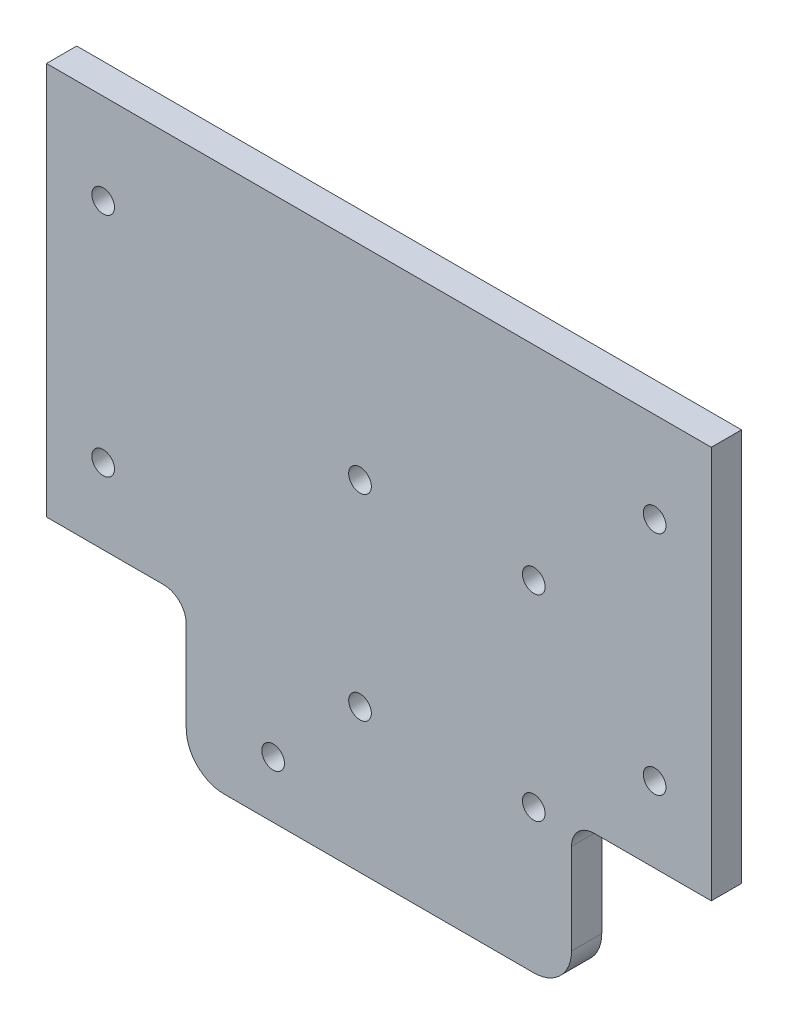
ISO-10303-21;
HEADER;
FILE_DESCRIPTION(('STEP AP214'),'2;1');
FILE_NAME('part.step','',(''),(''),'','','');
FILE_SCHEMA(('AUTOMOTIVE_DESIGN { 1 0 10303 214 1 1 1 1 }'));
ENDSEC;
DATA;
#1=APPLICATION_CONTEXT('core data for automotive mechanical design processes');
#2=APPLICATION_PROTOCOL_DEFINITION('international standard','automotive_design',2000,#1);
#3=PRODUCT_CONTEXT('',#1,'mechanical');
#4=PRODUCT('Part','Part','',(#3));
#5=PRODUCT_RELATED_PRODUCT_CATEGORY('part','',(#4));
#6=PRODUCT_DEFINITION_FORMATION('','',#4);
#7=PRODUCT_DEFINITION_CONTEXT('part definition',#1,'design');
#8=PRODUCT_DEFINITION('design','',#6,#7);
#9=PRODUCT_DEFINITION_SHAPE('','',#8);
#10=(LENGTH_UNIT() NAMED_UNIT(*) SI_UNIT(.MILLI.,.METRE.));
#11=(NAMED_UNIT(*) PLANE_ANGLE_UNIT() SI_UNIT($,.RADIAN.));
#12=(NAMED_UNIT(*) SI_UNIT($,.STERADIAN.) SOLID_ANGLE_UNIT());
#13=UNCERTAINTY_MEASURE_WITH_UNIT(LENGTH_MEASURE(1.E-05),#10,'distance_accuracy_value','');
#14=(GEOMETRIC_REPRESENTATION_CONTEXT(3) GLOBAL_UNCERTAINTY_ASSIGNED_CONTEXT((#13)) GLOBAL_UNIT_ASSIGNED_CONTEXT((#10,
#11,#12)) REPRESENTATION_CONTEXT('',''));
#15=CARTESIAN_POINT('',(0.,0.,0.));
#16=DIRECTION('',(0.,0.,1.));
#17=DIRECTION('',(1.,0.,0.));
#18=AXIS2_PLACEMENT_3D('',#15,#16,#17);
#19=CARTESIAN_POINT('',(0.,0.,4.));
#20=DIRECTION('',(1.,0.,0.));
#21=DIRECTION('',(0.,0.,-1.));
#22=AXIS2_PLACEMENT_3D('',#19,#20,#21);
#23=PLANE('',#22);
#24=DIRECTION('',(0.,-1.,0.));
#25=VECTOR('',#24,1.);
#26=CARTESIAN_POINT('',(0.,0.,0.));
#27=LINE('',#26,#25);
#28=CARTESIAN_POINT('',(0.,72.,0.));
#29=VERTEX_POINT('',#28);
#30=CARTESIAN_POINT('',(0.,20.,0.));
#31=VERTEX_POINT('',#30);
#32=EDGE_CURVE('E168',#29,#31,#27,.T.);
#33=ORIENTED_EDGE('',*,*,#32,.T.);
#34=DIRECTION('',(0.,0.,1.));
#35=VECTOR('',#34,1.);
#36=CARTESIAN_POINT('',(0.,20.,0.));
#37=LINE('',#36,#35);
#38=CARTESIAN_POINT('',(0.,20.,4.));
#39=VERTEX_POINT('',#38);
#40=EDGE_CURVE('E254',#31,#39,#37,.T.);
#41=ORIENTED_EDGE('',*,*,#40,.T.);
#42=DIRECTION('',(0.,-1.,0.));
#43=VECTOR('',#42,1.);
#44=CARTESIAN_POINT('',(0.,0.,4.));
#45=LINE('',#44,#43);
#46=CARTESIAN_POINT('',(0.,72.,4.));
#47=VERTEX_POINT('',#46);
#48=EDGE_CURVE('E165',#47,#39,#45,.T.);
#49=ORIENTED_EDGE('',*,*,#48,.F.);
#50=DIRECTION('',(0.,0.,-1.));
#51=VECTOR('',#50,1.);
#52=CARTESIAN_POINT('',(0.,72.,4.));
#53=LINE('',#52,#51);
#54=EDGE_CURVE('E172',#47,#29,#53,.T.);
#55=ORIENTED_EDGE('',*,*,#54,.T.);
#56=EDGE_LOOP('',(#33,#41,#49,#55));
#57=FACE_BOUND('',#56,.T.);
#58=ADVANCED_FACE('F40',(#57),#23,.F.);
#59=CARTESIAN_POINT('',(0.,0.,4.));
#60=DIRECTION('',(0.,1.,0.));
#61=DIRECTION('',(0.,0.,1.));
#62=AXIS2_PLACEMENT_3D('',#59,#60,#61);
#63=PLANE('',#62);
#64=DIRECTION('',(1.,0.,0.));
#65=VECTOR('',#64,1.);
#66=CARTESIAN_POINT('',(0.,0.,0.));
#67=LINE('',#66,#65);
#68=CARTESIAN_POINT('',(23.5,0.,0.));
#69=VERTEX_POINT('',#68);
#70=CARTESIAN_POINT('',(64.5,0.,0.));
#71=VERTEX_POINT('',#70);
#72=EDGE_CURVE('E161',#69,#71,#67,.T.);
#73=ORIENTED_EDGE('',*,*,#72,.T.);
#74=DIRECTION('',(0.,0.,1.));
#75=VECTOR('',#74,1.);
#76=CARTESIAN_POINT('',(64.5,0.,4.));
#77=LINE('',#76,#75);
#78=CARTESIAN_POINT('',(64.5,0.,4.));
#79=VERTEX_POINT('',#78);
#80=EDGE_CURVE('E210',#71,#79,#77,.T.);
#81=ORIENTED_EDGE('',*,*,#80,.T.);
#82=DIRECTION('',(1.,0.,0.));
#83=VECTOR('',#82,1.);
#84=CARTESIAN_POINT('',(0.,0.,4.));
#85=LINE('',#84,#83);
#86=CARTESIAN_POINT('',(23.5,0.,4.));
#87=VERTEX_POINT('',#86);
#88=EDGE_CURVE('E236',#87,#79,#85,.T.);
#89=ORIENTED_EDGE('',*,*,#88,.F.);
#90=DIRECTION('',(0.,0.,1.));
#91=VECTOR('',#90,1.);
#92=CARTESIAN_POINT('',(23.5,0.,4.));
#93=LINE('',#92,#91);
#94=EDGE_CURVE('E207',#87,#69,#93,.F.);
#95=ORIENTED_EDGE('',*,*,#94,.T.);
#96=EDGE_LOOP('',(#73,#81,#89,#95));
#97=FACE_BOUND('',#96,.T.);
#98=ADVANCED_FACE('F228',(#97),#63,.F.);
#99=CARTESIAN_POINT('',(88.,0.,4.));
#100=DIRECTION('',(-1.,0.,0.));
#101=DIRECTION('',(0.,0.,1.));
#102=AXIS2_PLACEMENT_3D('',#99,#100,#101);
#103=PLANE('',#102);
#104=DIRECTION('',(0.,1.,0.));
#105=VECTOR('',#104,1.);
#106=CARTESIAN_POINT('',(88.,0.,4.));
#107=LINE('',#106,#105);
#108=CARTESIAN_POINT('',(88.,20.,4.));
#109=VERTEX_POINT('',#108);
#110=CARTESIAN_POINT('',(88.,72.,4.));
#111=VERTEX_POINT('',#110);
#112=EDGE_CURVE('E152',#109,#111,#107,.T.);
#113=ORIENTED_EDGE('',*,*,#112,.F.);
#114=DIRECTION('',(0.,0.,1.));
#115=VECTOR('',#114,1.);
#116=CARTESIAN_POINT('',(88.,20.,0.));
#117=LINE('',#116,#115);
#118=CARTESIAN_POINT('',(88.,20.,0.));
#119=VERTEX_POINT('',#118);
#120=EDGE_CURVE('E136',#119,#109,#117,.T.);
#121=ORIENTED_EDGE('',*,*,#120,.F.);
#122=DIRECTION('',(0.,1.,0.));
#123=VECTOR('',#122,1.);
#124=CARTESIAN_POINT('',(88.,0.,0.));
#125=LINE('',#124,#123);
#126=CARTESIAN_POINT('',(88.,72.,0.));
#127=VERTEX_POINT('',#126);
#128=EDGE_CURVE('E150',#119,#127,#125,.T.);
#129=ORIENTED_EDGE('',*,*,#128,.T.);
#130=DIRECTION('',(0.,0.,-1.));
#131=VECTOR('',#130,1.);
#132=CARTESIAN_POINT('',(88.,72.,4.));
#133=LINE('',#132,#131);
#134=EDGE_CURVE('E176',#111,#127,#133,.T.);
#135=ORIENTED_EDGE('',*,*,#134,.F.);
#136=EDGE_LOOP('',(#113,#121,#129,#135));
#137=FACE_BOUND('',#136,.T.);
#138=ADVANCED_FACE('F148',(#137),#103,.F.);
#139=CARTESIAN_POINT('',(0.,72.,4.));
#140=DIRECTION('',(0.,-1.,0.));
#141=DIRECTION('',(0.,0.,-1.));
#142=AXIS2_PLACEMENT_3D('',#139,#140,#141);
#143=PLANE('',#142);
#144=DIRECTION('',(-1.,0.,0.));
#145=VECTOR('',#144,1.);
#146=CARTESIAN_POINT('',(0.,72.,0.));
#147=LINE('',#146,#145);
#148=EDGE_CURVE('E159',#127,#29,#147,.T.);
#149=ORIENTED_EDGE('',*,*,#148,.T.);
#150=ORIENTED_EDGE('',*,*,#54,.F.);
#151=DIRECTION('',(-1.,0.,0.));
#152=VECTOR('',#151,1.);
#153=CARTESIAN_POINT('',(0.,72.,4.));
#154=LINE('',#153,#152);
#155=EDGE_CURVE('E177',#111,#47,#154,.T.);
#156=ORIENTED_EDGE('',*,*,#155,.F.);
#157=ORIENTED_EDGE('',*,*,#134,.T.);
#158=EDGE_LOOP('',(#149,#150,#156,#157));
#159=FACE_BOUND('',#158,.T.);
#160=ADVANCED_FACE('F286',(#159),#143,.F.);
#161=CARTESIAN_POINT('',(0.,0.,4.));
#162=DIRECTION('',(0.,0.,-1.));
#163=DIRECTION('',(-1.,0.,0.));
#164=AXIS2_PLACEMENT_3D('',#161,#162,#163);
#165=PLANE('',#164);
#166=CARTESIAN_POINT('',(41.5,19.,4.));
#167=DIRECTION('',(0.,0.,1.));
#168=DIRECTION('',(1.,0.,0.));
#169=AXIS2_PLACEMENT_3D('',#166,#167,#168);
#170=CIRCLE('',#169,1.5);
#171=CARTESIAN_POINT('',(43.,19.,4.));
#172=VERTEX_POINT('',#171);
#173=EDGE_CURVE('E439',#172,#172,#170,.T.);
#174=ORIENTED_EDGE('',*,*,#173,.F.);
#175=EDGE_LOOP('',(#174));
#176=FACE_BOUND('',#175,.T.);
#177=CARTESIAN_POINT('',(64.5,19.,4.));
#178=DIRECTION('',(0.,0.,1.));
#179=DIRECTION('',(1.,0.,0.));
#180=AXIS2_PLACEMENT_3D('',#177,#178,#179);
#181=CIRCLE('',#180,1.5);
#182=CARTESIAN_POINT('',(66.,19.,4.));
#183=VERTEX_POINT('',#182);
#184=EDGE_CURVE('E445',#183,#183,#181,.T.);
#185=ORIENTED_EDGE('',*,*,#184,.F.);
#186=EDGE_LOOP('',(#185));
#187=FACE_BOUND('',#186,.T.);
#188=CARTESIAN_POINT('',(64.5,45.,4.));
#189=DIRECTION('',(0.,0.,1.));
#190=DIRECTION('',(1.,0.,0.));
#191=AXIS2_PLACEMENT_3D('',#188,#189,#190);
#192=CIRCLE('',#191,1.5);
#193=CARTESIAN_POINT('',(66.,45.,4.));
#194=VERTEX_POINT('',#193);
#195=EDGE_CURVE('E451',#194,#194,#192,.T.);
#196=ORIENTED_EDGE('',*,*,#195,.F.);
#197=EDGE_LOOP('',(#196));
#198=FACE_BOUND('',#197,.T.);
#199=CARTESIAN_POINT('',(41.5,45.,4.));
#200=DIRECTION('',(0.,0.,1.));
#201=DIRECTION('',(1.,0.,0.));
#202=AXIS2_PLACEMENT_3D('',#199,#200,#201);
#203=CIRCLE('',#202,1.5);
#204=CARTESIAN_POINT('',(43.,45.,4.));
#205=VERTEX_POINT('',#204);
#206=EDGE_CURVE('E433',#205,#205,#203,.T.);
#207=ORIENTED_EDGE('',*,*,#206,.F.);
#208=EDGE_LOOP('',(#207));
#209=FACE_BOUND('',#208,.T.);
#210=CARTESIAN_POINT('',(7.49999999999999,60.,4.));
#211=DIRECTION('',(0.,0.,1.));
#212=DIRECTION('',(-1.,0.,0.));
#213=AXIS2_PLACEMENT_3D('',#210,#211,#212);
#214=CIRCLE('',#213,1.5);
#215=CARTESIAN_POINT('',(5.99999999999999,60.,4.));
#216=VERTEX_POINT('',#215);
#217=EDGE_CURVE('E408',#216,#216,#214,.T.);
#218=ORIENTED_EDGE('',*,*,#217,.F.);
#219=EDGE_LOOP('',(#218));
#220=FACE_BOUND('',#219,.T.);
#221=CARTESIAN_POINT('',(7.49999999999999,30.,4.));
#222=DIRECTION('',(0.,0.,1.));
#223=DIRECTION('',(-1.,0.,0.));
#224=AXIS2_PLACEMENT_3D('',#221,#222,#223);
#225=CIRCLE('',#224,1.5);
#226=CARTESIAN_POINT('',(5.99999999999999,30.,4.));
#227=VERTEX_POINT('',#226);
#228=EDGE_CURVE('E415',#227,#227,#225,.T.);
#229=ORIENTED_EDGE('',*,*,#228,.F.);
#230=EDGE_LOOP('',(#229));
#231=FACE_BOUND('',#230,.T.);
#232=CARTESIAN_POINT('',(30.,7.5,4.));
#233=DIRECTION('',(0.,0.,1.));
#234=DIRECTION('',(-1.,0.,0.));
#235=AXIS2_PLACEMENT_3D('',#232,#233,#234);
#236=CIRCLE('',#235,1.5);
#237=CARTESIAN_POINT('',(28.5,7.5,4.));
#238=VERTEX_POINT('',#237);
#239=EDGE_CURVE('E421',#238,#238,#236,.T.);
#240=ORIENTED_EDGE('',*,*,#239,.F.);
#241=EDGE_LOOP('',(#240));
#242=FACE_BOUND('',#241,.T.);
#243=CARTESIAN_POINT('',(80.5,30.,4.));
#244=DIRECTION('',(0.,0.,1.));
#245=DIRECTION('',(1.,0.,0.));
#246=AXIS2_PLACEMENT_3D('',#243,#244,#245);
#247=CIRCLE('',#246,1.5);
#248=CARTESIAN_POINT('',(82.,30.,4.));
#249=VERTEX_POINT('',#248);
#250=EDGE_CURVE('E427',#249,#249,#247,.T.);
#251=ORIENTED_EDGE('',*,*,#250,.F.);
#252=EDGE_LOOP('',(#251));
#253=FACE_BOUND('',#252,.T.);
#254=CARTESIAN_POINT('',(80.5,60.,4.));
#255=DIRECTION('',(0.,0.,1.));
#256=DIRECTION('',(1.,0.,0.));
#257=AXIS2_PLACEMENT_3D('',#254,#255,#256);
#258=CIRCLE('',#257,1.5);
#259=CARTESIAN_POINT('',(82.,60.,4.));
#260=VERTEX_POINT('',#259);
#261=EDGE_CURVE('E402',#260,#260,#258,.T.);
#262=ORIENTED_EDGE('',*,*,#261,.F.);
#263=EDGE_LOOP('',(#262));
#264=FACE_BOUND('',#263,.T.);
#265=ORIENTED_EDGE('',*,*,#88,.T.);
#266=CARTESIAN_POINT('',(64.5,5.,4.));
#267=DIRECTION('',(0.,0.,-1.));
#268=DIRECTION('',(-1.,0.,0.));
#269=AXIS2_PLACEMENT_3D('',#266,#267,#268);
#270=CIRCLE('',#269,5.);
#271=CARTESIAN_POINT('',(69.5,5.,4.));
#272=VERTEX_POINT('',#271);
#273=EDGE_CURVE('E217',#79,#272,#270,.F.);
#274=ORIENTED_EDGE('',*,*,#273,.T.);
#275=DIRECTION('',(0.,-1.,0.));
#276=VECTOR('',#275,1.);
#277=CARTESIAN_POINT('',(69.5,0.,4.));
#278=LINE('',#277,#276);
#279=CARTESIAN_POINT('',(69.5,17.,4.));
#280=VERTEX_POINT('',#279);
#281=EDGE_CURVE('E144',#280,#272,#278,.T.);
#282=ORIENTED_EDGE('',*,*,#281,.F.);
#283=CARTESIAN_POINT('',(72.5,17.,4.));
#284=DIRECTION('',(0.,0.,-1.));
#285=DIRECTION('',(-1.,0.,0.));
#286=AXIS2_PLACEMENT_3D('',#283,#284,#285);
#287=CIRCLE('',#286,3.);
#288=CARTESIAN_POINT('',(72.5,20.,4.));
#289=VERTEX_POINT('',#288);
#290=EDGE_CURVE('E201',#280,#289,#287,.T.);
#291=ORIENTED_EDGE('',*,*,#290,.T.);
#292=DIRECTION('',(-1.,0.,0.));
#293=VECTOR('',#292,1.);
#294=CARTESIAN_POINT('',(88.,20.,4.));
#295=LINE('',#294,#293);
#296=EDGE_CURVE('E240',#109,#289,#295,.T.);
#297=ORIENTED_EDGE('',*,*,#296,.F.);
#298=ORIENTED_EDGE('',*,*,#112,.T.);
#299=ORIENTED_EDGE('',*,*,#155,.T.);
#300=ORIENTED_EDGE('',*,*,#48,.T.);
#301=DIRECTION('',(-1.,0.,0.));
#302=VECTOR('',#301,1.);
#303=CARTESIAN_POINT('',(0.,20.,4.));
#304=LINE('',#303,#302);
#305=CARTESIAN_POINT('',(15.5,20.,4.));
#306=VERTEX_POINT('',#305);
#307=EDGE_CURVE('E251',#306,#39,#304,.T.);
#308=ORIENTED_EDGE('',*,*,#307,.F.);
#309=CARTESIAN_POINT('',(15.5,17.,4.));
#310=DIRECTION('',(0.,0.,-1.));
#311=DIRECTION('',(-1.,0.,0.));
#312=AXIS2_PLACEMENT_3D('',#309,#310,#311);
#313=CIRCLE('',#312,3.);
#314=CARTESIAN_POINT('',(18.5,17.,4.));
#315=VERTEX_POINT('',#314);
#316=EDGE_CURVE('E188',#306,#315,#313,.T.);
#317=ORIENTED_EDGE('',*,*,#316,.T.);
#318=DIRECTION('',(0.,1.,0.));
#319=VECTOR('',#318,1.);
#320=CARTESIAN_POINT('',(18.5,0.,4.));
#321=LINE('',#320,#319);
#322=CARTESIAN_POINT('',(18.5,5.,4.));
#323=VERTEX_POINT('',#322);
#324=EDGE_CURVE('E154',#323,#315,#321,.T.);
#325=ORIENTED_EDGE('',*,*,#324,.F.);
#326=CARTESIAN_POINT('',(23.5,5.,4.));
#327=DIRECTION('',(0.,0.,-1.));
#328=DIRECTION('',(-1.,0.,0.));
#329=AXIS2_PLACEMENT_3D('',#326,#327,#328);
#330=CIRCLE('',#329,5.);
#331=EDGE_CURVE('E214',#323,#87,#330,.F.);
#332=ORIENTED_EDGE('',*,*,#331,.T.);
#333=EDGE_LOOP('',(#265,#274,#282,#291,#297,#298,#299,#300,#308,#317,#325,#332));
#334=FACE_BOUND('',#333,.T.);
#335=ADVANCED_FACE('F235',(#176,#187,#198,#209,#220,#231,#242,#253,#264,#334),#165,.F.);
#336=CARTESIAN_POINT('',(0.,0.,0.));
#337=DIRECTION('',(0.,0.,-1.));
#338=DIRECTION('',(-1.,0.,0.));
#339=AXIS2_PLACEMENT_3D('',#336,#337,#338);
#340=PLANE('',#339);
#341=CARTESIAN_POINT('',(41.5,19.,0.));
#342=DIRECTION('',(0.,0.,1.));
#343=DIRECTION('',(1.,0.,0.));
#344=AXIS2_PLACEMENT_3D('',#341,#342,#343);
#345=CIRCLE('',#344,1.5);
#346=CARTESIAN_POINT('',(43.,19.,0.));
#347=VERTEX_POINT('',#346);
#348=EDGE_CURVE('E370',#347,#347,#345,.T.);
#349=ORIENTED_EDGE('',*,*,#348,.T.);
#350=EDGE_LOOP('',(#349));
#351=FACE_BOUND('',#350,.T.);
#352=CARTESIAN_POINT('',(64.5,19.,0.));
#353=DIRECTION('',(0.,0.,1.));
#354=DIRECTION('',(1.,0.,0.));
#355=AXIS2_PLACEMENT_3D('',#352,#353,#354);
#356=CIRCLE('',#355,1.5);
#357=CARTESIAN_POINT('',(66.,19.,0.));
#358=VERTEX_POINT('',#357);
#359=EDGE_CURVE('E374',#358,#358,#356,.T.);
#360=ORIENTED_EDGE('',*,*,#359,.T.);
#361=EDGE_LOOP('',(#360));
#362=FACE_BOUND('',#361,.T.);
#363=CARTESIAN_POINT('',(64.5,45.,0.));
#364=DIRECTION('',(0.,0.,1.));
#365=DIRECTION('',(1.,0.,0.));
#366=AXIS2_PLACEMENT_3D('',#363,#364,#365);
#367=CIRCLE('',#366,1.5);
#368=CARTESIAN_POINT('',(66.,45.,0.));
#369=VERTEX_POINT('',#368);
#370=EDGE_CURVE('E378',#369,#369,#367,.T.);
#371=ORIENTED_EDGE('',*,*,#370,.T.);
#372=EDGE_LOOP('',(#371));
#373=FACE_BOUND('',#372,.T.);
#374=CARTESIAN_POINT('',(41.5,45.,0.));
#375=DIRECTION('',(0.,0.,1.));
#376=DIRECTION('',(1.,0.,0.));
#377=AXIS2_PLACEMENT_3D('',#374,#375,#376);
#378=CIRCLE('',#377,1.5);
#379=CARTESIAN_POINT('',(43.,45.,0.));
#380=VERTEX_POINT('',#379);
#381=EDGE_CURVE('E382',#380,#380,#378,.T.);
#382=ORIENTED_EDGE('',*,*,#381,.T.);
#383=EDGE_LOOP('',(#382));
#384=FACE_BOUND('',#383,.T.);
#385=CARTESIAN_POINT('',(7.49999999999999,60.,0.));
#386=DIRECTION('',(0.,0.,1.));
#387=DIRECTION('',(-1.,0.,0.));
#388=AXIS2_PLACEMENT_3D('',#385,#386,#387);
#389=CIRCLE('',#388,1.5);
#390=CARTESIAN_POINT('',(5.99999999999999,60.,0.));
#391=VERTEX_POINT('',#390);
#392=EDGE_CURVE('E386',#391,#391,#389,.T.);
#393=ORIENTED_EDGE('',*,*,#392,.T.);
#394=EDGE_LOOP('',(#393));
#395=FACE_BOUND('',#394,.T.);
#396=CARTESIAN_POINT('',(7.49999999999999,30.,0.));
#397=DIRECTION('',(0.,0.,1.));
#398=DIRECTION('',(-1.,0.,0.));
#399=AXIS2_PLACEMENT_3D('',#396,#397,#398);
#400=CIRCLE('',#399,1.5);
#401=CARTESIAN_POINT('',(5.99999999999999,30.,0.));
#402=VERTEX_POINT('',#401);
#403=EDGE_CURVE('E390',#402,#402,#400,.T.);
#404=ORIENTED_EDGE('',*,*,#403,.T.);
#405=EDGE_LOOP('',(#404));
#406=FACE_BOUND('',#405,.T.);
#407=CARTESIAN_POINT('',(30.,7.5,0.));
#408=DIRECTION('',(0.,0.,1.));
#409=DIRECTION('',(-1.,0.,0.));
#410=AXIS2_PLACEMENT_3D('',#407,#408,#409);
#411=CIRCLE('',#410,1.5);
#412=CARTESIAN_POINT('',(28.5,7.5,0.));
#413=VERTEX_POINT('',#412);
#414=EDGE_CURVE('E394',#413,#413,#411,.T.);
#415=ORIENTED_EDGE('',*,*,#414,.T.);
#416=EDGE_LOOP('',(#415));
#417=FACE_BOUND('',#416,.T.);
#418=CARTESIAN_POINT('',(80.5,30.,0.));
#419=DIRECTION('',(0.,0.,1.));
#420=DIRECTION('',(1.,0.,0.));
#421=AXIS2_PLACEMENT_3D('',#418,#419,#420);
#422=CIRCLE('',#421,1.5);
#423=CARTESIAN_POINT('',(82.,30.,0.));
#424=VERTEX_POINT('',#423);
#425=EDGE_CURVE('E398',#424,#424,#422,.T.);
#426=ORIENTED_EDGE('',*,*,#425,.T.);
#427=EDGE_LOOP('',(#426));
#428=FACE_BOUND('',#427,.T.);
#429=CARTESIAN_POINT('',(80.5,60.,0.));
#430=DIRECTION('',(0.,0.,1.));
#431=DIRECTION('',(1.,0.,0.));
#432=AXIS2_PLACEMENT_3D('',#429,#430,#431);
#433=CIRCLE('',#432,1.5);
#434=CARTESIAN_POINT('',(82.,60.,0.));
#435=VERTEX_POINT('',#434);
#436=EDGE_CURVE('E243',#435,#435,#433,.T.);
#437=ORIENTED_EDGE('',*,*,#436,.T.);
#438=EDGE_LOOP('',(#437));
#439=FACE_BOUND('',#438,.T.);
#440=DIRECTION('',(0.,-1.,0.));
#441=VECTOR('',#440,1.);
#442=CARTESIAN_POINT('',(69.5,0.,0.));
#443=LINE('',#442,#441);
#444=CARTESIAN_POINT('',(69.5,17.,0.));
#445=VERTEX_POINT('',#444);
#446=CARTESIAN_POINT('',(69.5,5.,0.));
#447=VERTEX_POINT('',#446);
#448=EDGE_CURVE('E143',#445,#447,#443,.T.);
#449=ORIENTED_EDGE('',*,*,#448,.T.);
#450=CARTESIAN_POINT('',(64.5,5.,0.));
#451=DIRECTION('',(0.,0.,-1.));
#452=DIRECTION('',(-1.,0.,0.));
#453=AXIS2_PLACEMENT_3D('',#450,#451,#452);
#454=CIRCLE('',#453,5.);
#455=EDGE_CURVE('E49',#447,#71,#454,.T.);
#456=ORIENTED_EDGE('',*,*,#455,.T.);
#457=ORIENTED_EDGE('',*,*,#72,.F.);
#458=CARTESIAN_POINT('',(23.5,5.,0.));
#459=DIRECTION('',(0.,0.,-1.));
#460=DIRECTION('',(-1.,0.,0.));
#461=AXIS2_PLACEMENT_3D('',#458,#459,#460);
#462=CIRCLE('',#461,5.);
#463=CARTESIAN_POINT('',(18.5,5.,0.));
#464=VERTEX_POINT('',#463);
#465=EDGE_CURVE('E56',#69,#464,#462,.T.);
#466=ORIENTED_EDGE('',*,*,#465,.T.);
#467=DIRECTION('',(0.,1.,0.));
#468=VECTOR('',#467,1.);
#469=CARTESIAN_POINT('',(18.5,0.,0.));
#470=LINE('',#469,#468);
#471=CARTESIAN_POINT('',(18.5,17.,0.));
#472=VERTEX_POINT('',#471);
#473=EDGE_CURVE('E247',#464,#472,#470,.T.);
#474=ORIENTED_EDGE('',*,*,#473,.T.);
#475=CARTESIAN_POINT('',(15.5,17.,0.));
#476=DIRECTION('',(0.,0.,-1.));
#477=DIRECTION('',(-1.,0.,0.));
#478=AXIS2_PLACEMENT_3D('',#475,#476,#477);
#479=CIRCLE('',#478,3.);
#480=CARTESIAN_POINT('',(15.5,20.,0.));
#481=VERTEX_POINT('',#480);
#482=EDGE_CURVE('E192',#472,#481,#479,.F.);
#483=ORIENTED_EDGE('',*,*,#482,.T.);
#484=DIRECTION('',(-1.,0.,0.));
#485=VECTOR('',#484,1.);
#486=CARTESIAN_POINT('',(0.,20.,0.));
#487=LINE('',#486,#485);
#488=EDGE_CURVE('E250',#481,#31,#487,.T.);
#489=ORIENTED_EDGE('',*,*,#488,.T.);
#490=ORIENTED_EDGE('',*,*,#32,.F.);
#491=ORIENTED_EDGE('',*,*,#148,.F.);
#492=ORIENTED_EDGE('',*,*,#128,.F.);
#493=DIRECTION('',(-1.,0.,0.));
#494=VECTOR('',#493,1.);
#495=CARTESIAN_POINT('',(88.,20.,0.));
#496=LINE('',#495,#494);
#497=CARTESIAN_POINT('',(72.5,20.,0.));
#498=VERTEX_POINT('',#497);
#499=EDGE_CURVE('E132',#119,#498,#496,.T.);
#500=ORIENTED_EDGE('',*,*,#499,.T.);
#501=CARTESIAN_POINT('',(72.5,17.,0.));
#502=DIRECTION('',(0.,0.,-1.));
#503=DIRECTION('',(-1.,0.,0.));
#504=AXIS2_PLACEMENT_3D('',#501,#502,#503);
#505=CIRCLE('',#504,3.);
#506=EDGE_CURVE('E204',#498,#445,#505,.F.);
#507=ORIENTED_EDGE('',*,*,#506,.T.);
#508=EDGE_LOOP('',(#449,#456,#457,#466,#474,#483,#489,#490,#491,#492,#500,#507));
#509=FACE_BOUND('',#508,.T.);
#510=ADVANCED_FACE('F157',(#351,#362,#373,#384,#395,#406,#417,#428,#439,#509),#340,.T.);
#511=CARTESIAN_POINT('',(0.,20.,0.));
#512=DIRECTION('',(0.,1.,0.));
#513=DIRECTION('',(0.,0.,1.));
#514=AXIS2_PLACEMENT_3D('',#511,#512,#513);
#515=PLANE('',#514);
#516=ORIENTED_EDGE('',*,*,#488,.F.);
#517=DIRECTION('',(0.,0.,1.));
#518=VECTOR('',#517,1.);
#519=CARTESIAN_POINT('',(15.5,20.,4.));
#520=LINE('',#519,#518);
#521=EDGE_CURVE('E180',#481,#306,#520,.T.);
#522=ORIENTED_EDGE('',*,*,#521,.T.);
#523=ORIENTED_EDGE('',*,*,#307,.T.);
#524=ORIENTED_EDGE('',*,*,#40,.F.);
#525=EDGE_LOOP('',(#516,#522,#523,#524));
#526=FACE_BOUND('',#525,.T.);
#527=ADVANCED_FACE('F280',(#526),#515,.F.);
#528=CARTESIAN_POINT('',(18.5,0.,0.));
#529=DIRECTION('',(1.,0.,0.));
#530=DIRECTION('',(0.,0.,-1.));
#531=AXIS2_PLACEMENT_3D('',#528,#529,#530);
#532=PLANE('',#531);
#533=ORIENTED_EDGE('',*,*,#473,.F.);
#534=DIRECTION('',(0.,0.,1.));
#535=VECTOR('',#534,1.);
#536=CARTESIAN_POINT('',(18.5,5.,0.));
#537=LINE('',#536,#535);
#538=EDGE_CURVE('E11',#464,#323,#537,.T.);
#539=ORIENTED_EDGE('',*,*,#538,.T.);
#540=ORIENTED_EDGE('',*,*,#324,.T.);
#541=DIRECTION('',(0.,0.,1.));
#542=VECTOR('',#541,1.);
#543=CARTESIAN_POINT('',(18.5,17.,0.));
#544=LINE('',#543,#542);
#545=EDGE_CURVE('E184',#315,#472,#544,.F.);
#546=ORIENTED_EDGE('',*,*,#545,.T.);
#547=EDGE_LOOP('',(#533,#539,#540,#546));
#548=FACE_BOUND('',#547,.T.);
#549=ADVANCED_FACE('F307',(#548),#532,.F.);
#550=CARTESIAN_POINT('',(15.5,17.,0.));
#551=DIRECTION('',(0.,0.,-1.));
#552=DIRECTION('',(-1.,0.,0.));
#553=AXIS2_PLACEMENT_3D('',#550,#551,#552);
#554=CYLINDRICAL_SURFACE('',#553,3.);
#555=ORIENTED_EDGE('',*,*,#482,.F.);
#556=ORIENTED_EDGE('',*,*,#545,.F.);
#557=ORIENTED_EDGE('',*,*,#316,.F.);
#558=ORIENTED_EDGE('',*,*,#521,.F.);
#559=EDGE_LOOP('',(#555,#556,#557,#558));
#560=FACE_BOUND('',#559,.T.);
#561=ADVANCED_FACE('F304',(#560),#554,.F.);
#562=CARTESIAN_POINT('',(69.5,0.,0.));
#563=DIRECTION('',(-1.,0.,0.));
#564=DIRECTION('',(0.,0.,1.));
#565=AXIS2_PLACEMENT_3D('',#562,#563,#564);
#566=PLANE('',#565);
#567=ORIENTED_EDGE('',*,*,#281,.T.);
#568=DIRECTION('',(0.,0.,1.));
#569=VECTOR('',#568,1.);
#570=CARTESIAN_POINT('',(69.5,5.,0.));
#571=LINE('',#570,#569);
#572=EDGE_CURVE('E64',#272,#447,#571,.F.);
#573=ORIENTED_EDGE('',*,*,#572,.T.);
#574=ORIENTED_EDGE('',*,*,#448,.F.);
#575=DIRECTION('',(0.,0.,1.));
#576=VECTOR('',#575,1.);
#577=CARTESIAN_POINT('',(69.5,17.,4.));
#578=LINE('',#577,#576);
#579=EDGE_CURVE('E195',#445,#280,#578,.T.);
#580=ORIENTED_EDGE('',*,*,#579,.T.);
#581=EDGE_LOOP('',(#567,#573,#574,#580));
#582=FACE_BOUND('',#581,.T.);
#583=ADVANCED_FACE('F237',(#582),#566,.F.);
#584=CARTESIAN_POINT('',(88.,20.,0.));
#585=DIRECTION('',(0.,1.,0.));
#586=DIRECTION('',(-1.,0.,0.));
#587=AXIS2_PLACEMENT_3D('',#584,#585,#586);
#588=PLANE('',#587);
#589=ORIENTED_EDGE('',*,*,#296,.T.);
#590=DIRECTION('',(0.,0.,1.));
#591=VECTOR('',#590,1.);
#592=CARTESIAN_POINT('',(72.5,20.,0.));
#593=LINE('',#592,#591);
#594=EDGE_CURVE('E139',#289,#498,#593,.F.);
#595=ORIENTED_EDGE('',*,*,#594,.T.);
#596=ORIENTED_EDGE('',*,*,#499,.F.);
#597=ORIENTED_EDGE('',*,*,#120,.T.);
#598=EDGE_LOOP('',(#589,#595,#596,#597));
#599=FACE_BOUND('',#598,.T.);
#600=ADVANCED_FACE('F135',(#599),#588,.F.);
#601=CARTESIAN_POINT('',(72.5,17.,0.));
#602=DIRECTION('',(0.,0.,-1.));
#603=DIRECTION('',(-1.,0.,0.));
#604=AXIS2_PLACEMENT_3D('',#601,#602,#603);
#605=CYLINDRICAL_SURFACE('',#604,3.);
#606=ORIENTED_EDGE('',*,*,#506,.F.);
#607=ORIENTED_EDGE('',*,*,#594,.F.);
#608=ORIENTED_EDGE('',*,*,#290,.F.);
#609=ORIENTED_EDGE('',*,*,#579,.F.);
#610=EDGE_LOOP('',(#606,#607,#608,#609));
#611=FACE_BOUND('',#610,.T.);
#612=ADVANCED_FACE('F309',(#611),#605,.F.);
#613=CARTESIAN_POINT('',(80.5,60.,0.));
#614=DIRECTION('',(0.,0.,1.));
#615=DIRECTION('',(1.,0.,0.));
#616=AXIS2_PLACEMENT_3D('',#613,#614,#615);
#617=CYLINDRICAL_SURFACE('',#616,1.5);
#618=ORIENTED_EDGE('',*,*,#436,.F.);
#619=EDGE_LOOP('',(#618));
#620=FACE_BOUND('',#619,.T.);
#621=ORIENTED_EDGE('',*,*,#261,.T.);
#622=EDGE_LOOP('',(#621));
#623=FACE_BOUND('',#622,.T.);
#624=ADVANCED_FACE('F311',(#620,#623),#617,.F.);
#625=CARTESIAN_POINT('',(80.5,30.,0.));
#626=DIRECTION('',(0.,0.,1.));
#627=DIRECTION('',(1.,0.,0.));
#628=AXIS2_PLACEMENT_3D('',#625,#626,#627);
#629=CYLINDRICAL_SURFACE('',#628,1.5);
#630=ORIENTED_EDGE('',*,*,#425,.F.);
#631=EDGE_LOOP('',(#630));
#632=FACE_BOUND('',#631,.T.);
#633=ORIENTED_EDGE('',*,*,#250,.T.);
#634=EDGE_LOOP('',(#633));
#635=FACE_BOUND('',#634,.T.);
#636=ADVANCED_FACE('F338',(#632,#635),#629,.F.);
#637=CARTESIAN_POINT('',(30.,7.5,0.));
#638=DIRECTION('',(0.,0.,1.));
#639=DIRECTION('',(1.,0.,0.));
#640=AXIS2_PLACEMENT_3D('',#637,#638,#639);
#641=CYLINDRICAL_SURFACE('',#640,1.5);
#642=ORIENTED_EDGE('',*,*,#414,.F.);
#643=EDGE_LOOP('',(#642));
#644=FACE_BOUND('',#643,.T.);
#645=ORIENTED_EDGE('',*,*,#239,.T.);
#646=EDGE_LOOP('',(#645));
#647=FACE_BOUND('',#646,.T.);
#648=ADVANCED_FACE('F341',(#644,#647),#641,.F.);
#649=CARTESIAN_POINT('',(7.49999999999999,30.,0.));
#650=DIRECTION('',(0.,0.,1.));
#651=DIRECTION('',(1.,0.,0.));
#652=AXIS2_PLACEMENT_3D('',#649,#650,#651);
#653=CYLINDRICAL_SURFACE('',#652,1.5);
#654=ORIENTED_EDGE('',*,*,#403,.F.);
#655=EDGE_LOOP('',(#654));
#656=FACE_BOUND('',#655,.T.);
#657=ORIENTED_EDGE('',*,*,#228,.T.);
#658=EDGE_LOOP('',(#657));
#659=FACE_BOUND('',#658,.T.);
#660=ADVANCED_FACE('F345',(#656,#659),#653,.F.);
#661=CARTESIAN_POINT('',(7.49999999999999,60.,0.));
#662=DIRECTION('',(0.,0.,1.));
#663=DIRECTION('',(1.,0.,0.));
#664=AXIS2_PLACEMENT_3D('',#661,#662,#663);
#665=CYLINDRICAL_SURFACE('',#664,1.5);
#666=ORIENTED_EDGE('',*,*,#392,.F.);
#667=EDGE_LOOP('',(#666));
#668=FACE_BOUND('',#667,.T.);
#669=ORIENTED_EDGE('',*,*,#217,.T.);
#670=EDGE_LOOP('',(#669));
#671=FACE_BOUND('',#670,.T.);
#672=ADVANCED_FACE('F336',(#668,#671),#665,.F.);
#673=CARTESIAN_POINT('',(41.5,45.,0.));
#674=DIRECTION('',(0.,0.,1.));
#675=DIRECTION('',(1.,0.,0.));
#676=AXIS2_PLACEMENT_3D('',#673,#674,#675);
#677=CYLINDRICAL_SURFACE('',#676,1.5);
#678=ORIENTED_EDGE('',*,*,#381,.F.);
#679=EDGE_LOOP('',(#678));
#680=FACE_BOUND('',#679,.T.);
#681=ORIENTED_EDGE('',*,*,#206,.T.);
#682=EDGE_LOOP('',(#681));
#683=FACE_BOUND('',#682,.T.);
#684=ADVANCED_FACE('F333',(#680,#683),#677,.F.);
#685=CARTESIAN_POINT('',(64.5,45.,0.));
#686=DIRECTION('',(0.,0.,1.));
#687=DIRECTION('',(1.,0.,0.));
#688=AXIS2_PLACEMENT_3D('',#685,#686,#687);
#689=CYLINDRICAL_SURFACE('',#688,1.5);
#690=ORIENTED_EDGE('',*,*,#370,.F.);
#691=EDGE_LOOP('',(#690));
#692=FACE_BOUND('',#691,.T.);
#693=ORIENTED_EDGE('',*,*,#195,.T.);
#694=EDGE_LOOP('',(#693));
#695=FACE_BOUND('',#694,.T.);
#696=ADVANCED_FACE('F326',(#692,#695),#689,.F.);
#697=CARTESIAN_POINT('',(64.5,19.,0.));
#698=DIRECTION('',(0.,0.,1.));
#699=DIRECTION('',(1.,0.,0.));
#700=AXIS2_PLACEMENT_3D('',#697,#698,#699);
#701=CYLINDRICAL_SURFACE('',#700,1.5);
#702=ORIENTED_EDGE('',*,*,#359,.F.);
#703=EDGE_LOOP('',(#702));
#704=FACE_BOUND('',#703,.T.);
#705=ORIENTED_EDGE('',*,*,#184,.T.);
#706=EDGE_LOOP('',(#705));
#707=FACE_BOUND('',#706,.T.);
#708=ADVANCED_FACE('F320',(#704,#707),#701,.F.);
#709=CARTESIAN_POINT('',(41.5,19.,0.));
#710=DIRECTION('',(0.,0.,1.));
#711=DIRECTION('',(1.,0.,0.));
#712=AXIS2_PLACEMENT_3D('',#709,#710,#711);
#713=CYLINDRICAL_SURFACE('',#712,1.5);
#714=ORIENTED_EDGE('',*,*,#348,.F.);
#715=EDGE_LOOP('',(#714));
#716=FACE_BOUND('',#715,.T.);
#717=ORIENTED_EDGE('',*,*,#173,.T.);
#718=EDGE_LOOP('',(#717));
#719=FACE_BOUND('',#718,.T.);
#720=ADVANCED_FACE('F314',(#716,#719),#713,.F.);
#721=CARTESIAN_POINT('',(64.5,5.,4.));
#722=DIRECTION('',(0.,0.,1.));
#723=DIRECTION('',(1.,0.,0.));
#724=AXIS2_PLACEMENT_3D('',#721,#722,#723);
#725=CYLINDRICAL_SURFACE('',#724,5.);
#726=ORIENTED_EDGE('',*,*,#455,.F.);
#727=ORIENTED_EDGE('',*,*,#572,.F.);
#728=ORIENTED_EDGE('',*,*,#273,.F.);
#729=ORIENTED_EDGE('',*,*,#80,.F.);
#730=EDGE_LOOP('',(#726,#727,#728,#729));
#731=FACE_BOUND('',#730,.T.);
#732=ADVANCED_FACE('F232',(#731),#725,.T.);
#733=CARTESIAN_POINT('',(23.5,5.,0.));
#734=DIRECTION('',(0.,0.,1.));
#735=DIRECTION('',(1.,0.,0.));
#736=AXIS2_PLACEMENT_3D('',#733,#734,#735);
#737=CYLINDRICAL_SURFACE('',#736,5.);
#738=ORIENTED_EDGE('',*,*,#465,.F.);
#739=ORIENTED_EDGE('',*,*,#94,.F.);
#740=ORIENTED_EDGE('',*,*,#331,.F.);
#741=ORIENTED_EDGE('',*,*,#538,.F.);
#742=EDGE_LOOP('',(#738,#739,#740,#741));
#743=FACE_BOUND('',#742,.T.);
#744=ADVANCED_FACE('F42',(#743),#737,.T.);
#745=CLOSED_SHELL('',(#58,#98,#138,#160,#335,#510,#527,#549,#561,#583,#600,#612,#624,#636,#648,
#660,#672,#684,#696,#708,#720,#732,#744));
#746=MANIFOLD_SOLID_BREP('B2',#745);
#747=ADVANCED_BREP_SHAPE_REPRESENTATION('',(#18,#746),#14);
#748=SHAPE_DEFINITION_REPRESENTATION(#9,#747);
ENDSEC;
END-ISO-10303-21;
